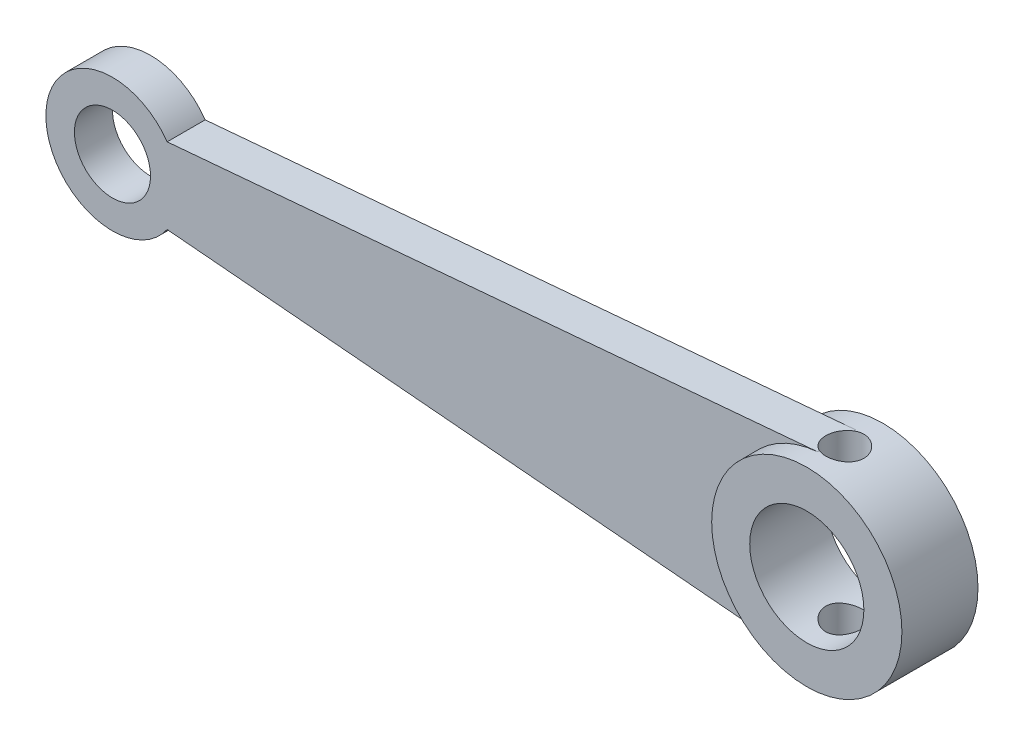
ISO-10303-21;
HEADER;
FILE_DESCRIPTION(('STEP AP214'),'2;1');
FILE_NAME('part.step','',(''),(''),'','','');
FILE_SCHEMA(('AUTOMOTIVE_DESIGN { 1 0 10303 214 1 1 1 1 }'));
ENDSEC;
DATA;
#1=APPLICATION_CONTEXT('core data for automotive mechanical design processes');
#2=APPLICATION_PROTOCOL_DEFINITION('international standard','automotive_design',2000,#1);
#3=PRODUCT_CONTEXT('',#1,'mechanical');
#4=PRODUCT('Part','Part','',(#3));
#5=PRODUCT_RELATED_PRODUCT_CATEGORY('part','',(#4));
#6=PRODUCT_DEFINITION_FORMATION('','',#4);
#7=PRODUCT_DEFINITION_CONTEXT('part definition',#1,'design');
#8=PRODUCT_DEFINITION('design','',#6,#7);
#9=PRODUCT_DEFINITION_SHAPE('','',#8);
#10=(LENGTH_UNIT() NAMED_UNIT(*) SI_UNIT(.MILLI.,.METRE.));
#11=(NAMED_UNIT(*) PLANE_ANGLE_UNIT() SI_UNIT($,.RADIAN.));
#12=(NAMED_UNIT(*) SI_UNIT($,.STERADIAN.) SOLID_ANGLE_UNIT());
#13=UNCERTAINTY_MEASURE_WITH_UNIT(LENGTH_MEASURE(1.E-05),#10,'distance_accuracy_value','');
#14=(GEOMETRIC_REPRESENTATION_CONTEXT(3) GLOBAL_UNCERTAINTY_ASSIGNED_CONTEXT((#13)) GLOBAL_UNIT_ASSIGNED_CONTEXT((#10,
#11,#12)) REPRESENTATION_CONTEXT('',''));
#15=CARTESIAN_POINT('',(0.,0.,0.));
#16=DIRECTION('',(0.,0.,1.));
#17=DIRECTION('',(1.,0.,0.));
#18=AXIS2_PLACEMENT_3D('',#15,#16,#17);
#19=CARTESIAN_POINT('',(0.,-25.,0.));
#20=DIRECTION('',(0.,1.,0.));
#21=DIRECTION('',(0.,0.,1.));
#22=AXIS2_PLACEMENT_3D('',#19,#20,#21);
#23=CYLINDRICAL_SURFACE('',#22,1.);
#24=CARTESIAN_POINT('',(0.,-3.,1.));
#25=CARTESIAN_POINT('',(0.0545633628867233,-3.00000015300943,1.00000025373164));
#26=CARTESIAN_POINT('',(0.10912519453855,-2.99849769507545,0.995519733872783));
#27=CARTESIAN_POINT('',(0.216641760872972,-2.99265210203281,0.977770891182781));
#28=CARTESIAN_POINT('',(0.269596328118818,-2.98830867202153,0.964501656051078));
#29=CARTESIAN_POINT('',(0.372332789501776,-2.97725307906443,0.929680756615952));
#30=CARTESIAN_POINT('',(0.422119825886034,-2.97054487730853,0.908142937540728));
#31=CARTESIAN_POINT('',(0.517374936805325,-2.95544445717342,0.857458827161653));
#32=CARTESIAN_POINT('',(0.562842156958706,-2.94705190667778,0.828311034997399));
#33=CARTESIAN_POINT('',(0.649741675022266,-2.92914094443005,0.762174195141247));
#34=CARTESIAN_POINT('',(0.691003700298309,-2.91959556463785,0.724968765739507));
#35=CARTESIAN_POINT('',(0.766832692702084,-2.90060314783122,0.644232845293434));
#36=CARTESIAN_POINT('',(0.801398185489462,-2.89115613290549,0.600700965071487));
#37=CARTESIAN_POINT('',(0.863824942227859,-2.87313332477274,0.50701488480354));
#38=CARTESIAN_POINT('',(0.891464858221032,-2.86459039275688,0.456706260267877));
#39=CARTESIAN_POINT('',(0.937818873877722,-2.84975305418601,0.351823905541453));
#40=CARTESIAN_POINT('',(0.956535697386765,-2.84345796160746,0.297251482837256));
#41=CARTESIAN_POINT('',(0.983873461509163,-2.83411303269377,0.18732677850329));
#42=CARTESIAN_POINT('',(0.992813448271769,-2.83096095769611,0.132062791510935));
#43=CARTESIAN_POINT('',(1.00134112333448,-2.82795656629508,0.020736245844119));
#44=CARTESIAN_POINT('',(1.00093170160472,-2.8281032302273,-0.0353260607091905));
#45=CARTESIAN_POINT('',(0.991019903703419,-2.8315901500818,-0.143936630444021));
#46=CARTESIAN_POINT('',(0.981933913166995,-2.83478415867533,-0.196528402919019));
#47=CARTESIAN_POINT('',(0.955606162849417,-2.84376657724551,-0.299393419606834));
#48=CARTESIAN_POINT('',(0.938363426591871,-2.84955529784108,-0.34966638543507));
#49=CARTESIAN_POINT('',(0.895939058060211,-2.86317911131249,-0.447412749591479));
#50=CARTESIAN_POINT('',(0.870634048707263,-2.87104565793117,-0.494828025469526));
#51=CARTESIAN_POINT('',(0.812889106303139,-2.88792558575726,-0.584870908279727));
#52=CARTESIAN_POINT('',(0.780447112364005,-2.89693929790464,-0.627497126933381));
#53=CARTESIAN_POINT('',(0.707349332682237,-2.91567329167741,-0.709091598160772));
#54=CARTESIAN_POINT('',(0.666353150076311,-2.92540589354843,-0.74775269450907));
#55=CARTESIAN_POINT('',(0.578339569970064,-2.94406938387037,-0.817731266663398));
#56=CARTESIAN_POINT('',(0.531321595660814,-2.95300019538067,-0.849048038164496));
#57=CARTESIAN_POINT('',(0.431947613046267,-2.96917107937794,-0.903696300235069));
#58=CARTESIAN_POINT('',(0.379543276416336,-2.97639350008039,-0.926945491340732));
#59=CARTESIAN_POINT('',(0.271269083364508,-2.98820567144435,-0.964203173955711));
#60=CARTESIAN_POINT('',(0.215400438154954,-2.99279633654879,-0.978214875423438));
#61=CARTESIAN_POINT('',(0.104383829529304,-2.99867627071441,-0.996055666022358));
#62=CARTESIAN_POINT('',(0.0493095998648451,-3.00010001833731,-1.00029980917275));
#63=CARTESIAN_POINT('',(-0.0607750699602366,-2.99988902694825,-0.999667326401533));
#64=CARTESIAN_POINT('',(-0.115785519319647,-2.99825480419352,-0.994792240020132));
#65=CARTESIAN_POINT('',(-0.222519866304259,-2.99220024717114,-0.976388092264033));
#66=CARTESIAN_POINT('',(-0.274292806834856,-2.98786198711228,-0.963113793950476));
#67=CARTESIAN_POINT('',(-0.374855958579561,-2.97691846830034,-0.928606555533301));
#68=CARTESIAN_POINT('',(-0.423645788508559,-2.97031292046541,-0.907372600532325));
#69=CARTESIAN_POINT('',(-0.518288296393322,-2.95528931287427,-0.8569295681591));
#70=CARTESIAN_POINT('',(-0.56402995921733,-2.94682814756305,-0.8275254067164));
#71=CARTESIAN_POINT('',(-0.650064830135404,-2.92905253915743,-0.761805849986946));
#72=CARTESIAN_POINT('',(-0.690356367794894,-2.91973783591888,-0.725488343969838));
#73=CARTESIAN_POINT('',(-0.766252507807014,-2.90076847982472,-0.645021248991735));
#74=CARTESIAN_POINT('',(-0.801560969248492,-2.89111761095155,-0.600590773066751));
#75=CARTESIAN_POINT('',(-0.864257522320854,-2.87299973286981,-0.5062284321955));
#76=CARTESIAN_POINT('',(-0.891645547920843,-2.8645327335312,-0.456296521389797));
#77=CARTESIAN_POINT('',(-0.93759693042336,-2.84982391820308,-0.352326984693406));
#78=CARTESIAN_POINT('',(-0.956178132197766,-2.84357760900632,-0.298297920757221));
#79=CARTESIAN_POINT('',(-0.983894666792162,-2.83410832399133,-0.187621349875851));
#80=CARTESIAN_POINT('',(-0.993034254961243,-2.83088398622698,-0.130975034566937));
#81=CARTESIAN_POINT('',(-1.00127628247038,-2.82797858875071,-0.019802903986789));
#82=CARTESIAN_POINT('',(-1.00087025731093,-2.82812400344299,0.0346823402517368));
#83=CARTESIAN_POINT('',(-0.991242293454878,-2.8315126992356,0.142765074899743));
#84=CARTESIAN_POINT('',(-0.982020879458887,-2.83475579595884,0.196362617952911));
#85=CARTESIAN_POINT('',(-0.95537181312698,-2.84384524278943,0.300135663012667));
#86=CARTESIAN_POINT('',(-0.938103346014879,-2.84964098015514,0.350356825007233));
#87=CARTESIAN_POINT('',(-0.895979365760381,-2.86316398825434,0.447227406935533));
#88=CARTESIAN_POINT('',(-0.871122168553979,-2.87089168765297,0.493876031187259));
#89=CARTESIAN_POINT('',(-0.813260692583249,-2.8878282922406,0.584483669923692));
#90=CARTESIAN_POINT('',(-0.779948242764532,-2.89708711641604,0.628236501898595));
#91=CARTESIAN_POINT('',(-0.706642883135697,-2.91583356283786,0.709689813383991));
#92=CARTESIAN_POINT('',(-0.666648084451495,-2.92532124912518,0.747388575688018));
#93=CARTESIAN_POINT('',(-0.579241556920674,-2.94390030525393,0.817144412289238));
#94=CARTESIAN_POINT('',(-0.531601513499725,-2.95296181801216,0.848924347751015));
#95=CARTESIAN_POINT('',(-0.431357357406629,-2.96925991172652,0.903990428850631));
#96=CARTESIAN_POINT('',(-0.37875451813235,-2.9764969590794,0.927278745922038));
#97=CARTESIAN_POINT('',(-0.272493647200975,-2.98805515068532,0.963721632488676));
#98=CARTESIAN_POINT('',(-0.218987757676409,-2.9924921242252,0.977282466263377));
#99=CARTESIAN_POINT('',(-0.110320416010247,-2.99846407064225,0.995420280677125));
#100=CARTESIAN_POINT('',(-0.0551594255687465,-2.99999984531906,0.999999743496537));
#101=CARTESIAN_POINT('',(0.,-3.,1.));
#102=B_SPLINE_CURVE_WITH_KNOTS('',3,(#24,#25,#26,#27,#28,#29,#30,#31,#32,#33,#34,#35,#36,#37,
#38,#39,#40,#41,#42,#43,#44,#45,#46,#47,#48,#49,#50,#51,#52,#53,#54,#55,#56,#57,#58,#59,#60,#61,
#62,#63,#64,#65,#66,#67,#68,#69,#70,#71,#72,#73,#74,#75,#76,#77,#78,#79,#80,#81,#82,#83,#84,#85,
#86,#87,#88,#89,#90,#91,#92,#93,#94,#95,#96,#97,#98,#99,#100,#101),.UNSPECIFIED.,.T.,.F.,(4,2,2,
2,2,2,2,2,2,2,2,2,2,2,2,2,2,2,2,2,2,2,2,2,2,2,2,2,2,2,2,2,2,2,2,2,2,2,4),(0.,0.163487106026011,
0.326991185267521,0.490222672870274,0.6534863777991,0.82184684282756,0.990244332875303,
1.1634838482347,1.33667044692833,1.5040192574184,1.67131633987485,1.8309682655128,
1.99063930855482,2.15288171155131,2.31517102558207,2.48593305811367,2.65671145966618,
2.82918405650358,3.00159668877208,3.1665358317517,3.33144713164177,3.49158157978213,
3.65173645284104,3.81610399843736,3.98052180821891,4.15241022880752,4.32430008234997,
4.49584013824416,4.66730284700846,4.82995666056619,4.99260079341185,5.15215587070228,
5.31174638165788,5.47830066681615,5.64490211113589,5.8179966082491,5.99104681142266,
6.15636558363624,6.3216386602795),.UNSPECIFIED.);
#103=CARTESIAN_POINT('',(0.,-3.,1.));
#104=VERTEX_POINT('',#103);
#105=EDGE_CURVE('E40',#104,#104,#102,.T.);
#106=ORIENTED_EDGE('',*,*,#105,.T.);
#107=EDGE_LOOP('',(#106));
#108=FACE_BOUND('',#107,.T.);
#109=CARTESIAN_POINT('',(0.,-5.01902540655219,0.));
#110=DIRECTION('',(0.0869881946922538,0.99620934244976,0.));
#111=DIRECTION('',(-0.99620934244976,0.0869881946922538,0.));
#112=AXIS2_PLACEMENT_3D('',#109,#110,#111);
#113=ELLIPSE('',#112,1.00380508131044,1.);
#114=CARTESIAN_POINT('',(-0.434940973461269,-4.9810467122488,-0.900458966085942));
#115=VERTEX_POINT('',#114);
#116=CARTESIAN_POINT('',(-0.434940973461269,-4.9810467122488,0.900458966085942));
#117=VERTEX_POINT('',#116);
#118=EDGE_CURVE('E11',#115,#117,#113,.T.);
#119=ORIENTED_EDGE('',*,*,#118,.F.);
#120=CARTESIAN_POINT('',(0.,-5.,1.));
#121=CARTESIAN_POINT('',(0.0555769067926332,-4.99999897580871,0.999997955501655));
#122=CARTESIAN_POINT('',(0.111179660201522,-4.99906385178231,0.995351157032355));
#123=CARTESIAN_POINT('',(0.220813507689019,-4.99542365623231,0.976901499884755));
#124=CARTESIAN_POINT('',(0.274843317541356,-4.99271717860186,0.96309136719849));
#125=CARTESIAN_POINT('',(0.379730305263313,-4.98583649278287,0.926758726379211));
#126=CARTESIAN_POINT('',(0.430590467933134,-4.98166369076718,0.904244563155312));
#127=CARTESIAN_POINT('',(0.527807988864225,-4.97230398035314,0.851167752488706));
#128=CARTESIAN_POINT('',(0.574165615075812,-4.96711713235707,0.820605584392795));
#129=CARTESIAN_POINT('',(0.661693477314865,-4.9562216532997,0.751861505708566));
#130=CARTESIAN_POINT('',(0.702793951158524,-4.95050745504347,0.713591644608798));
#131=CARTESIAN_POINT('',(0.778036756608028,-4.93924180452588,0.630707583608298));
#132=CARTESIAN_POINT('',(0.812178544770424,-4.93369036500424,0.586092888664882));
#133=CARTESIAN_POINT('',(0.87283175334762,-4.92332441812615,0.491283806988125));
#134=CARTESIAN_POINT('',(0.899270938865866,-4.91851707364946,0.441042356203641));
#135=CARTESIAN_POINT('',(0.943305666580308,-4.91026268058418,0.336718180995921));
#136=CARTESIAN_POINT('',(0.960902082437238,-4.90681549761962,0.282635836653655));
#137=CARTESIAN_POINT('',(0.986525299884827,-4.90172805252204,0.172915636092083));
#138=CARTESIAN_POINT('',(0.994674497958777,-4.90006470107188,0.117307455857774));
#139=CARTESIAN_POINT('',(1.00155212772612,-4.89866375060627,0.0054901786356578));
#140=CARTESIAN_POINT('',(1.0002815227135,-4.89892595467841,-0.050718856320145));
#141=CARTESIAN_POINT('',(0.988454573101819,-4.90132551148185,-0.161246788021003));
#142=CARTESIAN_POINT('',(0.978038540243905,-4.90343452858763,-0.215581405627314));
#143=CARTESIAN_POINT('',(0.94843788462305,-4.90924546160001,-0.321716076663002));
#144=CARTESIAN_POINT('',(0.929252843100681,-4.91294745357779,-0.373516008919008));
#145=CARTESIAN_POINT('',(0.88252478367472,-4.92155618500408,-0.473515261703599));
#146=CARTESIAN_POINT('',(0.854926151232114,-4.92647089813704,-0.521687879569172));
#147=CARTESIAN_POINT('',(0.792193574572679,-4.93694618773062,-0.612770849972814));
#148=CARTESIAN_POINT('',(0.757058764356829,-4.94250683838366,-0.655680596851157));
#149=CARTESIAN_POINT('',(0.679499934560584,-4.95377021241462,-0.735829402456936));
#150=CARTESIAN_POINT('',(0.636956161212445,-4.95947369210905,-0.77295256785913));
#151=CARTESIAN_POINT('',(0.54618502406201,-4.97028848714408,-0.839553846301224));
#152=CARTESIAN_POINT('',(0.497957587379389,-4.97539979488974,-0.869031861293579));
#153=CARTESIAN_POINT('',(0.397059386878921,-4.98446690160887,-0.919527509225975));
#154=CARTESIAN_POINT('',(0.3443818195853,-4.98842088848272,-0.940531893644537));
#155=CARTESIAN_POINT('',(0.236148976448665,-4.99471408987858,-0.973360474038566));
#156=CARTESIAN_POINT('',(0.18059405007245,-4.99705350000531,-0.985185782073628));
#157=CARTESIAN_POINT('',(0.0691794056271506,-4.99982671866868,-0.999156453794277));
#158=CARTESIAN_POINT('',(0.0133403283255763,-5.0002917465247,-1.00146041954027));
#159=CARTESIAN_POINT('',(-0.097924934192714,-4.99935051930103,-0.996750141057819));
#160=CARTESIAN_POINT('',(-0.153351142443793,-4.99794436941446,-0.989736420647404));
#161=CARTESIAN_POINT('',(-0.261705659946541,-4.99343832008018,-0.966721626456044));
#162=CARTESIAN_POINT('',(-0.314651948339903,-4.99035376404206,-0.950801931502097));
#163=CARTESIAN_POINT('',(-0.417123627499667,-4.98283552061033,-0.910516017344191));
#164=CARTESIAN_POINT('',(-0.466648761637539,-4.97840173214227,-0.88614916532317));
#165=CARTESIAN_POINT('',(-0.561541173686217,-4.96859911533294,-0.829317509348687));
#166=CARTESIAN_POINT('',(-0.606850126752188,-4.96321950437052,-0.796757218961055));
#167=CARTESIAN_POINT('',(-0.691418019119206,-4.95214734829882,-0.724590808792719));
#168=CARTESIAN_POINT('',(-0.730676308930762,-4.94645476968388,-0.684983933600133));
#169=CARTESIAN_POINT('',(-0.802640590774176,-4.93529303556965,-0.599126648108876));
#170=CARTESIAN_POINT('',(-0.835237702448655,-4.92982860233304,-0.552784255778663));
#171=CARTESIAN_POINT('',(-0.892185420051206,-4.91984191796194,-0.455188638643321));
#172=CARTESIAN_POINT('',(-0.916536355922903,-4.91531962913342,-0.403935610426447));
#173=CARTESIAN_POINT('',(-0.95615184158196,-4.90776740584383,-0.298231753850452));
#174=CARTESIAN_POINT('',(-0.971463499791051,-4.90472974872187,-0.243799158789681));
#175=CARTESIAN_POINT('',(-0.992708651627196,-4.90047436792025,-0.133066546509095));
#176=CARTESIAN_POINT('',(-0.998643368225112,-4.89925640691111,-0.0767667737906527));
#177=CARTESIAN_POINT('',(-1.00092091086747,-4.89879149631379,0.0350088645443185));
#178=CARTESIAN_POINT('',(-0.997435788070896,-4.89950919189301,0.0904811489270093));
#179=CARTESIAN_POINT('',(-0.981352304100061,-4.90275573484614,0.200031649905026));
#180=CARTESIAN_POINT('',(-0.968754016129298,-4.90528456767169,0.254109877694805));
#181=CARTESIAN_POINT('',(-0.934878568498954,-4.91185264219159,0.359227711240545));
#182=CARTESIAN_POINT('',(-0.913622506717345,-4.91588821018831,0.410274360502415));
#183=CARTESIAN_POINT('',(-0.863054644601604,-4.9250171497417,0.508103720734441));
#184=CARTESIAN_POINT('',(-0.833742168774882,-4.93011060998894,0.554886073725137));
#185=CARTESIAN_POINT('',(-0.767305914786414,-4.94088960523225,0.643715572150314));
#186=CARTESIAN_POINT('',(-0.73005788723518,-4.94658372909699,0.685668765267596));
#187=CARTESIAN_POINT('',(-0.649064369013141,-4.95786081871955,0.762786205529171));
#188=CARTESIAN_POINT('',(-0.605317387153335,-4.96344375863184,0.797948890317272));
#189=CARTESIAN_POINT('',(-0.512017629088246,-4.97393832387971,0.860834643946447));
#190=CARTESIAN_POINT('',(-0.462408884429835,-4.97884231219246,0.888476003280025));
#191=CARTESIAN_POINT('',(-0.359166360940733,-4.98735125085,0.934986122596592));
#192=CARTESIAN_POINT('',(-0.305536260863126,-4.99095737138616,0.953862789532492));
#193=CARTESIAN_POINT('',(-0.209821488923779,-4.99576372595371,0.978651948044716));
#194=CARTESIAN_POINT('',(-0.168281664013785,-4.99734303158452,0.986643193707758));
#195=CARTESIAN_POINT('',(-0.084499525210067,-4.99946154139893,0.997317912358364));
#196=CARTESIAN_POINT('',(-0.042257233748619,-5.00000077873155,1.00000155450977));
#197=CARTESIAN_POINT('',(0.,-5.,1.));
#198=B_SPLINE_CURVE_WITH_KNOTS('',3,(#120,#121,#122,#123,#124,#125,#126,#127,#128,#129,#130,
#131,#132,#133,#134,#135,#136,#137,#138,#139,#140,#141,#142,#143,#144,#145,#146,#147,#148,#149,
#150,#151,#152,#153,#154,#155,#156,#157,#158,#159,#160,#161,#162,#163,#164,#165,#166,#167,#168,
#169,#170,#171,#172,#173,#174,#175,#176,#177,#178,#179,#180,#181,#182,#183,#184,#185,#186,#187,
#188,#189,#190,#191,#192,#193,#194,#195,#196,#197),.UNSPECIFIED.,.T.,.F.,(4,2,2,2,2,2,2,2,2,2,2,
2,2,2,2,2,2,2,2,2,2,2,2,2,2,2,2,2,2,2,2,2,2,2,2,2,2,2,4),(0.,0.166576130661258,
0.333284650691323,0.499833735250341,0.666372902230863,0.834932670112186,1.00350559674737,
1.17361195005923,1.34370149365197,1.51156185103587,1.67940504281225,1.84471727006278,
2.0100373925373,2.17647490203593,2.3429315474967,2.51238252491351,2.6818356753982,
2.85155274854024,3.02124925698036,3.18810735676265,3.35495607657868,3.52030453950723,
3.68566539216022,3.85305066033358,4.0204538834593,4.19040628579226,4.36035188723466,
4.52940381032723,4.69843368330415,4.86439722567701,5.03035943492608,5.1959196125311,
5.36149367581867,5.52988076239143,5.6983065453293,5.86849496675637,6.03852955517519,
6.16518775289894,6.29184191370996),.UNSPECIFIED.);
#199=EDGE_CURVE('E64',#117,#115,#198,.T.);
#200=ORIENTED_EDGE('',*,*,#199,.F.);
#201=EDGE_LOOP('',(#119,#200));
#202=FACE_BOUND('',#201,.T.);
#203=ADVANCED_FACE('F35',(#108,#202),#23,.F.);
#204=CARTESIAN_POINT('',(0.,0.,-1.));
#205=DIRECTION('',(0.,0.,1.));
#206=DIRECTION('',(1.,0.,0.));
#207=AXIS2_PLACEMENT_3D('',#204,#205,#206);
#208=PLANE('',#207);
#209=CARTESIAN_POINT('',(-37.5,0.,-1.));
#210=DIRECTION('',(0.,0.,1.));
#211=DIRECTION('',(1.,0.,0.));
#212=AXIS2_PLACEMENT_3D('',#209,#210,#211);
#213=CIRCLE('',#212,2.);
#214=CARTESIAN_POINT('',(-35.5,0.,-1.));
#215=VERTEX_POINT('',#214);
#216=EDGE_CURVE('E119',#215,#215,#213,.T.);
#217=ORIENTED_EDGE('',*,*,#216,.T.);
#218=EDGE_LOOP('',(#217));
#219=FACE_BOUND('',#218,.T.);
#220=CARTESIAN_POINT('',(0.,0.,-1.));
#221=DIRECTION('',(0.,0.,1.));
#222=DIRECTION('',(1.,0.,0.));
#223=AXIS2_PLACEMENT_3D('',#220,#221,#222);
#224=CIRCLE('',#223,5.);
#225=CARTESIAN_POINT('',(-0.434940973461269,-4.9810467122488,-1.));
#226=VERTEX_POINT('',#225);
#227=CARTESIAN_POINT('',(-0.434940973461269,4.9810467122488,-1.));
#228=VERTEX_POINT('',#227);
#229=EDGE_CURVE('E50',#226,#228,#224,.F.);
#230=ORIENTED_EDGE('',*,*,#229,.F.);
#231=DIRECTION('',(0.99620934244976,-0.0869881946922538,0.));
#232=VECTOR('',#231,1.);
#233=CARTESIAN_POINT('',(-0.434940973461269,-4.9810467122488,-1.));
#234=LINE('',#233,#232);
#235=CARTESIAN_POINT('',(-34.6246782875445,-1.9956264805524,-1.));
#236=VERTEX_POINT('',#235);
#237=EDGE_CURVE('E110',#236,#226,#234,.T.);
#238=ORIENTED_EDGE('',*,*,#237,.F.);
#239=CARTESIAN_POINT('',(-37.5,0.,-1.));
#240=DIRECTION('',(0.,0.,1.));
#241=DIRECTION('',(1.,0.,0.));
#242=AXIS2_PLACEMENT_3D('',#239,#240,#241);
#243=CIRCLE('',#242,3.5);
#244=CARTESIAN_POINT('',(-34.6246782875445,1.9956264805524,-1.));
#245=VERTEX_POINT('',#244);
#246=EDGE_CURVE('E190',#245,#236,#243,.T.);
#247=ORIENTED_EDGE('',*,*,#246,.F.);
#248=DIRECTION('',(0.99620934244976,0.0869881946922537,0.));
#249=VECTOR('',#248,1.);
#250=CARTESIAN_POINT('',(-0.434940973461269,4.9810467122488,-1.));
#251=LINE('',#250,#249);
#252=EDGE_CURVE('E182',#245,#228,#251,.T.);
#253=ORIENTED_EDGE('',*,*,#252,.T.);
#254=EDGE_LOOP('',(#230,#238,#247,#253));
#255=FACE_BOUND('',#254,.T.);
#256=ADVANCED_FACE('F153',(#219,#255),#208,.F.);
#257=CARTESIAN_POINT('',(0.,0.,1.));
#258=DIRECTION('',(0.,0.,1.));
#259=DIRECTION('',(1.,0.,0.));
#260=AXIS2_PLACEMENT_3D('',#257,#258,#259);
#261=PLANE('',#260);
#262=CARTESIAN_POINT('',(-37.5,0.,1.));
#263=DIRECTION('',(0.,0.,1.));
#264=DIRECTION('',(1.,0.,0.));
#265=AXIS2_PLACEMENT_3D('',#262,#263,#264);
#266=CIRCLE('',#265,2.);
#267=CARTESIAN_POINT('',(-35.5,0.,1.));
#268=VERTEX_POINT('',#267);
#269=EDGE_CURVE('E111',#268,#268,#266,.T.);
#270=ORIENTED_EDGE('',*,*,#269,.F.);
#271=EDGE_LOOP('',(#270));
#272=FACE_BOUND('',#271,.T.);
#273=DIRECTION('',(0.99620934244976,-0.0869881946922538,0.));
#274=VECTOR('',#273,1.);
#275=CARTESIAN_POINT('',(-0.434940973461269,-4.9810467122488,1.));
#276=LINE('',#275,#274);
#277=CARTESIAN_POINT('',(-34.6246782875445,-1.9956264805524,1.));
#278=VERTEX_POINT('',#277);
#279=CARTESIAN_POINT('',(-0.434940973461269,-4.9810467122488,1.));
#280=VERTEX_POINT('',#279);
#281=EDGE_CURVE('E115',#278,#280,#276,.T.);
#282=ORIENTED_EDGE('',*,*,#281,.T.);
#283=CARTESIAN_POINT('',(0.,0.,1.));
#284=DIRECTION('',(0.,0.,1.));
#285=DIRECTION('',(1.,0.,0.));
#286=AXIS2_PLACEMENT_3D('',#283,#284,#285);
#287=CIRCLE('',#286,5.);
#288=CARTESIAN_POINT('',(-0.434940973461269,4.9810467122488,1.));
#289=VERTEX_POINT('',#288);
#290=EDGE_CURVE('E128',#280,#289,#287,.F.);
#291=ORIENTED_EDGE('',*,*,#290,.T.);
#292=DIRECTION('',(0.99620934244976,0.0869881946922537,0.));
#293=VECTOR('',#292,1.);
#294=CARTESIAN_POINT('',(-0.434940973461269,4.9810467122488,1.));
#295=LINE('',#294,#293);
#296=CARTESIAN_POINT('',(-34.6246782875445,1.9956264805524,1.));
#297=VERTEX_POINT('',#296);
#298=EDGE_CURVE('E183',#297,#289,#295,.T.);
#299=ORIENTED_EDGE('',*,*,#298,.F.);
#300=CARTESIAN_POINT('',(-37.5,0.,1.));
#301=DIRECTION('',(0.,0.,1.));
#302=DIRECTION('',(1.,0.,0.));
#303=AXIS2_PLACEMENT_3D('',#300,#301,#302);
#304=CIRCLE('',#303,3.5);
#305=EDGE_CURVE('E185',#297,#278,#304,.T.);
#306=ORIENTED_EDGE('',*,*,#305,.T.);
#307=EDGE_LOOP('',(#282,#291,#299,#306));
#308=FACE_BOUND('',#307,.T.);
#309=ADVANCED_FACE('F158',(#272,#308),#261,.T.);
#310=CARTESIAN_POINT('',(0.,0.,1.));
#311=DIRECTION('',(0.,0.,-1.));
#312=DIRECTION('',(-1.,0.,0.));
#313=AXIS2_PLACEMENT_3D('',#310,#311,#312);
#314=CYLINDRICAL_SURFACE('',#313,5.);
#315=DIRECTION('',(0.,0.,-1.));
#316=VECTOR('',#315,1.);
#317=CARTESIAN_POINT('',(-0.434940973461269,-4.9810467122488,1.));
#318=LINE('',#317,#316);
#319=EDGE_CURVE('E102',#280,#117,#318,.T.);
#320=ORIENTED_EDGE('',*,*,#319,.T.);
#321=ORIENTED_EDGE('',*,*,#199,.T.);
#322=EDGE_CURVE('E99',#115,#226,#318,.T.);
#323=ORIENTED_EDGE('',*,*,#322,.T.);
#324=ORIENTED_EDGE('',*,*,#229,.T.);
#325=DIRECTION('',(0.,0.,-1.));
#326=VECTOR('',#325,1.);
#327=CARTESIAN_POINT('',(-0.434940973461269,4.9810467122488,1.));
#328=LINE('',#327,#326);
#329=CARTESIAN_POINT('',(-0.434940973461269,4.9810467122488,-0.900458966085942));
#330=VERTEX_POINT('',#329);
#331=EDGE_CURVE('E124',#330,#228,#328,.T.);
#332=ORIENTED_EDGE('',*,*,#331,.F.);
#333=CARTESIAN_POINT('',(0.,5.,1.));
#334=CARTESIAN_POINT('',(-0.0555769067926332,4.99999897580871,0.999997955501655));
#335=CARTESIAN_POINT('',(-0.111179660201522,4.99906385178231,0.995351157032355));
#336=CARTESIAN_POINT('',(-0.220813507689019,4.99542365623231,0.976901499884755));
#337=CARTESIAN_POINT('',(-0.274843317541356,4.99271717860186,0.96309136719849));
#338=CARTESIAN_POINT('',(-0.379730305263313,4.98583649278287,0.926758726379211));
#339=CARTESIAN_POINT('',(-0.430590467933134,4.98166369076718,0.904244563155312));
#340=CARTESIAN_POINT('',(-0.527807988864225,4.97230398035314,0.851167752488706));
#341=CARTESIAN_POINT('',(-0.574165615075812,4.96711713235707,0.820605584392795));
#342=CARTESIAN_POINT('',(-0.661693477314865,4.9562216532997,0.751861505708566));
#343=CARTESIAN_POINT('',(-0.702793951158524,4.95050745504347,0.713591644608798));
#344=CARTESIAN_POINT('',(-0.778036756608028,4.93924180452588,0.630707583608298));
#345=CARTESIAN_POINT('',(-0.812178544770424,4.93369036500424,0.586092888664882));
#346=CARTESIAN_POINT('',(-0.87283175334762,4.92332441812615,0.491283806988125));
#347=CARTESIAN_POINT('',(-0.899270938865866,4.91851707364946,0.441042356203641));
#348=CARTESIAN_POINT('',(-0.943305666580308,4.91026268058418,0.336718180995921));
#349=CARTESIAN_POINT('',(-0.960902082437238,4.90681549761962,0.282635836653655));
#350=CARTESIAN_POINT('',(-0.986525299884827,4.90172805252204,0.172915636092083));
#351=CARTESIAN_POINT('',(-0.994674497958777,4.90006470107188,0.117307455857774));
#352=CARTESIAN_POINT('',(-1.00155212772612,4.89866375060627,0.0054901786356578));
#353=CARTESIAN_POINT('',(-1.0002815227135,4.89892595467841,-0.050718856320145));
#354=CARTESIAN_POINT('',(-0.988454573101819,4.90132551148185,-0.161246788021003));
#355=CARTESIAN_POINT('',(-0.978038540243905,4.90343452858763,-0.215581405627314));
#356=CARTESIAN_POINT('',(-0.94843788462305,4.90924546160001,-0.321716076663002));
#357=CARTESIAN_POINT('',(-0.929252843100681,4.91294745357779,-0.373516008919008));
#358=CARTESIAN_POINT('',(-0.88252478367472,4.92155618500408,-0.473515261703599));
#359=CARTESIAN_POINT('',(-0.854926151232114,4.92647089813704,-0.521687879569172));
#360=CARTESIAN_POINT('',(-0.792193574572679,4.93694618773062,-0.612770849972814));
#361=CARTESIAN_POINT('',(-0.757058764356829,4.94250683838366,-0.655680596851157));
#362=CARTESIAN_POINT('',(-0.679499934560584,4.95377021241462,-0.735829402456936));
#363=CARTESIAN_POINT('',(-0.636956161212445,4.95947369210905,-0.77295256785913));
#364=CARTESIAN_POINT('',(-0.54618502406201,4.97028848714408,-0.839553846301224));
#365=CARTESIAN_POINT('',(-0.497957587379389,4.97539979488974,-0.869031861293579));
#366=CARTESIAN_POINT('',(-0.397059386878921,4.98446690160887,-0.919527509225975));
#367=CARTESIAN_POINT('',(-0.3443818195853,4.98842088848272,-0.940531893644537));
#368=CARTESIAN_POINT('',(-0.236148976448665,4.99471408987858,-0.973360474038566));
#369=CARTESIAN_POINT('',(-0.18059405007245,4.99705350000531,-0.985185782073628));
#370=CARTESIAN_POINT('',(-0.0691794056271506,4.99982671866868,-0.999156453794277));
#371=CARTESIAN_POINT('',(-0.0133403283255763,5.0002917465247,-1.00146041954027));
#372=CARTESIAN_POINT('',(0.097924934192714,4.99935051930103,-0.996750141057819));
#373=CARTESIAN_POINT('',(0.153351142443793,4.99794436941446,-0.989736420647404));
#374=CARTESIAN_POINT('',(0.261705659946541,4.99343832008018,-0.966721626456044));
#375=CARTESIAN_POINT('',(0.314651948339903,4.99035376404206,-0.950801931502097));
#376=CARTESIAN_POINT('',(0.417123627499667,4.98283552061033,-0.910516017344191));
#377=CARTESIAN_POINT('',(0.466648761637539,4.97840173214227,-0.88614916532317));
#378=CARTESIAN_POINT('',(0.561541173686217,4.96859911533294,-0.829317509348687));
#379=CARTESIAN_POINT('',(0.606850126752188,4.96321950437052,-0.796757218961055));
#380=CARTESIAN_POINT('',(0.691418019119206,4.95214734829882,-0.724590808792719));
#381=CARTESIAN_POINT('',(0.730676308930762,4.94645476968388,-0.684983933600133));
#382=CARTESIAN_POINT('',(0.802640590774176,4.93529303556965,-0.599126648108876));
#383=CARTESIAN_POINT('',(0.835237702448655,4.92982860233304,-0.552784255778663));
#384=CARTESIAN_POINT('',(0.892185420051206,4.91984191796194,-0.455188638643321));
#385=CARTESIAN_POINT('',(0.916536355922903,4.91531962913342,-0.403935610426447));
#386=CARTESIAN_POINT('',(0.95615184158196,4.90776740584383,-0.298231753850452));
#387=CARTESIAN_POINT('',(0.971463499791051,4.90472974872187,-0.243799158789681));
#388=CARTESIAN_POINT('',(0.992708651627196,4.90047436792025,-0.133066546509095));
#389=CARTESIAN_POINT('',(0.998643368225112,4.89925640691111,-0.0767667737906527));
#390=CARTESIAN_POINT('',(1.00092091086747,4.89879149631379,0.0350088645443185));
#391=CARTESIAN_POINT('',(0.997435788070896,4.89950919189301,0.0904811489270093));
#392=CARTESIAN_POINT('',(0.981352304100061,4.90275573484614,0.200031649905026));
#393=CARTESIAN_POINT('',(0.968754016129298,4.90528456767169,0.254109877694805));
#394=CARTESIAN_POINT('',(0.934878568498954,4.91185264219159,0.359227711240545));
#395=CARTESIAN_POINT('',(0.913622506717345,4.91588821018831,0.410274360502415));
#396=CARTESIAN_POINT('',(0.863054644601604,4.9250171497417,0.508103720734441));
#397=CARTESIAN_POINT('',(0.833742168774882,4.93011060998894,0.554886073725137));
#398=CARTESIAN_POINT('',(0.767305914786414,4.94088960523225,0.643715572150314));
#399=CARTESIAN_POINT('',(0.73005788723518,4.94658372909699,0.685668765267596));
#400=CARTESIAN_POINT('',(0.649064369013141,4.95786081871955,0.762786205529171));
#401=CARTESIAN_POINT('',(0.605317387153335,4.96344375863184,0.797948890317272));
#402=CARTESIAN_POINT('',(0.512017629088246,4.97393832387971,0.860834643946447));
#403=CARTESIAN_POINT('',(0.462408884429835,4.97884231219246,0.888476003280025));
#404=CARTESIAN_POINT('',(0.359166360940733,4.98735125085,0.934986122596592));
#405=CARTESIAN_POINT('',(0.305536260863126,4.99095737138616,0.953862789532492));
#406=CARTESIAN_POINT('',(0.209821488923779,4.99576372595371,0.978651948044716));
#407=CARTESIAN_POINT('',(0.168281664013785,4.99734303158452,0.986643193707758));
#408=CARTESIAN_POINT('',(0.084499525210067,4.99946154139893,0.997317912358364));
#409=CARTESIAN_POINT('',(0.042257233748619,5.00000077873155,1.00000155450977));
#410=CARTESIAN_POINT('',(0.,5.,1.));
#411=B_SPLINE_CURVE_WITH_KNOTS('',3,(#333,#334,#335,#336,#337,#338,#339,#340,#341,#342,#343,
#344,#345,#346,#347,#348,#349,#350,#351,#352,#353,#354,#355,#356,#357,#358,#359,#360,#361,#362,
#363,#364,#365,#366,#367,#368,#369,#370,#371,#372,#373,#374,#375,#376,#377,#378,#379,#380,#381,
#382,#383,#384,#385,#386,#387,#388,#389,#390,#391,#392,#393,#394,#395,#396,#397,#398,#399,#400,
#401,#402,#403,#404,#405,#406,#407,#408,#409,#410),.UNSPECIFIED.,.T.,.F.,(4,2,2,2,2,2,2,2,2,2,2,
2,2,2,2,2,2,2,2,2,2,2,2,2,2,2,2,2,2,2,2,2,2,2,2,2,2,2,4),(0.,0.166576130661258,
0.333284650691323,0.499833735250341,0.666372902230863,0.834932670112186,1.00350559674737,
1.17361195005923,1.34370149365197,1.51156185103587,1.67940504281225,1.84471727006278,
2.0100373925373,2.17647490203593,2.3429315474967,2.51238252491351,2.6818356753982,
2.85155274854024,3.02124925698036,3.18810735676265,3.35495607657868,3.52030453950723,
3.68566539216022,3.85305066033358,4.0204538834593,4.19040628579226,4.36035188723466,
4.52940381032723,4.69843368330415,4.86439722567701,5.03035943492608,5.1959196125311,
5.36149367581867,5.52988076239143,5.6983065453293,5.86849496675637,6.03852955517519,
6.16518775289894,6.29184191370996),.UNSPECIFIED.);
#412=CARTESIAN_POINT('',(-0.434940973461269,4.9810467122488,0.900458966085942));
#413=VERTEX_POINT('',#412);
#414=EDGE_CURVE('E57',#330,#413,#411,.T.);
#415=ORIENTED_EDGE('',*,*,#414,.T.);
#416=EDGE_CURVE('E125',#289,#413,#328,.T.);
#417=ORIENTED_EDGE('',*,*,#416,.F.);
#418=ORIENTED_EDGE('',*,*,#290,.F.);
#419=EDGE_LOOP('',(#320,#321,#323,#324,#332,#415,#417,#418));
#420=FACE_BOUND('',#419,.T.);
#421=CARTESIAN_POINT('',(0.,0.,-2.));
#422=DIRECTION('',(0.,0.,-1.));
#423=DIRECTION('',(-1.,0.,0.));
#424=AXIS2_PLACEMENT_3D('',#421,#422,#423);
#425=CIRCLE('',#424,5.);
#426=CARTESIAN_POINT('',(-5.,0.,-2.));
#427=VERTEX_POINT('',#426);
#428=EDGE_CURVE('E176',#427,#427,#425,.T.);
#429=ORIENTED_EDGE('',*,*,#428,.F.);
#430=EDGE_LOOP('',(#429));
#431=FACE_BOUND('',#430,.T.);
#432=CARTESIAN_POINT('',(0.,0.,2.));
#433=DIRECTION('',(0.,0.,1.));
#434=DIRECTION('',(1.,0.,0.));
#435=AXIS2_PLACEMENT_3D('',#432,#433,#434);
#436=CIRCLE('',#435,5.);
#437=CARTESIAN_POINT('',(5.,0.,2.));
#438=VERTEX_POINT('',#437);
#439=EDGE_CURVE('E179',#438,#438,#436,.T.);
#440=ORIENTED_EDGE('',*,*,#439,.F.);
#441=EDGE_LOOP('',(#440));
#442=FACE_BOUND('',#441,.T.);
#443=ADVANCED_FACE('F37',(#420,#431,#442),#314,.T.);
#444=CARTESIAN_POINT('',(-0.434940973461269,4.9810467122488,1.));
#445=DIRECTION('',(-0.0869881946922537,0.99620934244976,0.));
#446=DIRECTION('',(-0.99620934244976,-0.0869881946922537,0.));
#447=AXIS2_PLACEMENT_3D('',#444,#445,#446);
#448=PLANE('',#447);
#449=CARTESIAN_POINT('',(0.,5.01902540655219,0.));
#450=DIRECTION('',(-0.0869881946922537,0.99620934244976,0.));
#451=DIRECTION('',(0.99620934244976,0.0869881946922537,0.));
#452=AXIS2_PLACEMENT_3D('',#449,#450,#451);
#453=ELLIPSE('',#452,1.00380508131044,1.);
#454=EDGE_CURVE('E103',#330,#413,#453,.T.);
#455=ORIENTED_EDGE('',*,*,#454,.F.);
#456=ORIENTED_EDGE('',*,*,#331,.T.);
#457=ORIENTED_EDGE('',*,*,#252,.F.);
#458=DIRECTION('',(0.,0.,-1.));
#459=VECTOR('',#458,1.);
#460=CARTESIAN_POINT('',(-34.6246782875445,1.9956264805524,1.));
#461=LINE('',#460,#459);
#462=EDGE_CURVE('E122',#297,#245,#461,.T.);
#463=ORIENTED_EDGE('',*,*,#462,.F.);
#464=ORIENTED_EDGE('',*,*,#298,.T.);
#465=ORIENTED_EDGE('',*,*,#416,.T.);
#466=EDGE_LOOP('',(#455,#456,#457,#463,#464,#465));
#467=FACE_BOUND('',#466,.T.);
#468=ADVANCED_FACE('F211',(#467),#448,.T.);
#469=CARTESIAN_POINT('',(-37.5,0.,1.));
#470=DIRECTION('',(0.,0.,-1.));
#471=DIRECTION('',(-1.,0.,0.));
#472=AXIS2_PLACEMENT_3D('',#469,#470,#471);
#473=CYLINDRICAL_SURFACE('',#472,3.5);
#474=ORIENTED_EDGE('',*,*,#246,.T.);
#475=DIRECTION('',(0.,0.,-1.));
#476=VECTOR('',#475,1.);
#477=CARTESIAN_POINT('',(-34.6246782875445,-1.9956264805524,1.));
#478=LINE('',#477,#476);
#479=EDGE_CURVE('E113',#278,#236,#478,.T.);
#480=ORIENTED_EDGE('',*,*,#479,.F.);
#481=ORIENTED_EDGE('',*,*,#305,.F.);
#482=ORIENTED_EDGE('',*,*,#462,.T.);
#483=EDGE_LOOP('',(#474,#480,#481,#482));
#484=FACE_BOUND('',#483,.T.);
#485=ADVANCED_FACE('F206',(#484),#473,.T.);
#486=CARTESIAN_POINT('',(-0.434940973461269,-4.9810467122488,1.));
#487=DIRECTION('',(0.0869881946922538,0.99620934244976,0.));
#488=DIRECTION('',(-0.99620934244976,0.0869881946922538,0.));
#489=AXIS2_PLACEMENT_3D('',#486,#487,#488);
#490=PLANE('',#489);
#491=ORIENTED_EDGE('',*,*,#322,.F.);
#492=ORIENTED_EDGE('',*,*,#118,.T.);
#493=ORIENTED_EDGE('',*,*,#319,.F.);
#494=ORIENTED_EDGE('',*,*,#281,.F.);
#495=ORIENTED_EDGE('',*,*,#479,.T.);
#496=ORIENTED_EDGE('',*,*,#237,.T.);
#497=EDGE_LOOP('',(#491,#492,#493,#494,#495,#496));
#498=FACE_BOUND('',#497,.T.);
#499=ADVANCED_FACE('F107',(#498),#490,.F.);
#500=CARTESIAN_POINT('',(-37.5,0.,1.));
#501=DIRECTION('',(0.,0.,-1.));
#502=DIRECTION('',(-1.,0.,0.));
#503=AXIS2_PLACEMENT_3D('',#500,#501,#502);
#504=CYLINDRICAL_SURFACE('',#503,2.);
#505=ORIENTED_EDGE('',*,*,#269,.T.);
#506=EDGE_LOOP('',(#505));
#507=FACE_BOUND('',#506,.T.);
#508=ORIENTED_EDGE('',*,*,#216,.F.);
#509=EDGE_LOOP('',(#508));
#510=FACE_BOUND('',#509,.T.);
#511=ADVANCED_FACE('F195',(#507,#510),#504,.F.);
#512=CARTESIAN_POINT('',(0.,0.,2.));
#513=DIRECTION('',(0.,0.,1.));
#514=DIRECTION('',(1.,0.,0.));
#515=AXIS2_PLACEMENT_3D('',#512,#513,#514);
#516=PLANE('',#515);
#517=CARTESIAN_POINT('',(0.,0.,2.));
#518=DIRECTION('',(0.,0.,1.));
#519=DIRECTION('',(1.,0.,0.));
#520=AXIS2_PLACEMENT_3D('',#517,#518,#519);
#521=CIRCLE('',#520,3.);
#522=CARTESIAN_POINT('',(3.,0.,2.));
#523=VERTEX_POINT('',#522);
#524=EDGE_CURVE('E104',#523,#523,#521,.T.);
#525=ORIENTED_EDGE('',*,*,#524,.F.);
#526=EDGE_LOOP('',(#525));
#527=FACE_BOUND('',#526,.T.);
#528=ORIENTED_EDGE('',*,*,#439,.T.);
#529=EDGE_LOOP('',(#528));
#530=FACE_BOUND('',#529,.T.);
#531=ADVANCED_FACE('F197',(#527,#530),#516,.T.);
#532=CARTESIAN_POINT('',(0.,0.,-2.));
#533=DIRECTION('',(0.,0.,-1.));
#534=DIRECTION('',(-1.,0.,0.));
#535=AXIS2_PLACEMENT_3D('',#532,#533,#534);
#536=PLANE('',#535);
#537=CARTESIAN_POINT('',(0.,0.,-2.));
#538=DIRECTION('',(0.,0.,-1.));
#539=DIRECTION('',(-1.,0.,0.));
#540=AXIS2_PLACEMENT_3D('',#537,#538,#539);
#541=CIRCLE('',#540,3.);
#542=CARTESIAN_POINT('',(-3.,0.,-2.));
#543=VERTEX_POINT('',#542);
#544=EDGE_CURVE('E136',#543,#543,#541,.T.);
#545=ORIENTED_EDGE('',*,*,#544,.F.);
#546=EDGE_LOOP('',(#545));
#547=FACE_BOUND('',#546,.T.);
#548=ORIENTED_EDGE('',*,*,#428,.T.);
#549=EDGE_LOOP('',(#548));
#550=FACE_BOUND('',#549,.T.);
#551=ADVANCED_FACE('F148',(#547,#550),#536,.T.);
#552=CARTESIAN_POINT('',(0.,3.,1.));
#553=CARTESIAN_POINT('',(-0.0545633628867233,3.00000015300943,1.00000025373164));
#554=CARTESIAN_POINT('',(-0.10912519453855,2.99849769507545,0.995519733872783));
#555=CARTESIAN_POINT('',(-0.216641760872972,2.99265210203281,0.977770891182781));
#556=CARTESIAN_POINT('',(-0.269596328118818,2.98830867202153,0.964501656051078));
#557=CARTESIAN_POINT('',(-0.372332789501776,2.97725307906443,0.929680756615952));
#558=CARTESIAN_POINT('',(-0.422119825886034,2.97054487730853,0.908142937540728));
#559=CARTESIAN_POINT('',(-0.517374936805325,2.95544445717342,0.857458827161653));
#560=CARTESIAN_POINT('',(-0.562842156958706,2.94705190667778,0.828311034997399));
#561=CARTESIAN_POINT('',(-0.649741675022266,2.92914094443005,0.762174195141247));
#562=CARTESIAN_POINT('',(-0.691003700298309,2.91959556463785,0.724968765739507));
#563=CARTESIAN_POINT('',(-0.766832692702084,2.90060314783122,0.644232845293434));
#564=CARTESIAN_POINT('',(-0.801398185489462,2.89115613290549,0.600700965071487));
#565=CARTESIAN_POINT('',(-0.863824942227859,2.87313332477274,0.50701488480354));
#566=CARTESIAN_POINT('',(-0.891464858221032,2.86459039275688,0.456706260267877));
#567=CARTESIAN_POINT('',(-0.937818873877722,2.84975305418601,0.351823905541453));
#568=CARTESIAN_POINT('',(-0.956535697386765,2.84345796160746,0.297251482837256));
#569=CARTESIAN_POINT('',(-0.983873461509163,2.83411303269377,0.18732677850329));
#570=CARTESIAN_POINT('',(-0.992813448271769,2.83096095769611,0.132062791510935));
#571=CARTESIAN_POINT('',(-1.00134112333448,2.82795656629508,0.020736245844119));
#572=CARTESIAN_POINT('',(-1.00093170160472,2.8281032302273,-0.0353260607091905));
#573=CARTESIAN_POINT('',(-0.991019903703419,2.8315901500818,-0.143936630444021));
#574=CARTESIAN_POINT('',(-0.981933913166995,2.83478415867533,-0.196528402919019));
#575=CARTESIAN_POINT('',(-0.955606162849417,2.84376657724551,-0.299393419606834));
#576=CARTESIAN_POINT('',(-0.938363426591871,2.84955529784108,-0.34966638543507));
#577=CARTESIAN_POINT('',(-0.895939058060211,2.86317911131249,-0.447412749591479));
#578=CARTESIAN_POINT('',(-0.870634048707263,2.87104565793117,-0.494828025469526));
#579=CARTESIAN_POINT('',(-0.812889106303139,2.88792558575726,-0.584870908279727));
#580=CARTESIAN_POINT('',(-0.780447112364005,2.89693929790464,-0.627497126933381));
#581=CARTESIAN_POINT('',(-0.707349332682237,2.91567329167741,-0.709091598160772));
#582=CARTESIAN_POINT('',(-0.666353150076311,2.92540589354843,-0.74775269450907));
#583=CARTESIAN_POINT('',(-0.578339569970064,2.94406938387037,-0.817731266663398));
#584=CARTESIAN_POINT('',(-0.531321595660814,2.95300019538067,-0.849048038164496));
#585=CARTESIAN_POINT('',(-0.431947613046267,2.96917107937794,-0.903696300235069));
#586=CARTESIAN_POINT('',(-0.379543276416336,2.97639350008039,-0.926945491340732));
#587=CARTESIAN_POINT('',(-0.271269083364508,2.98820567144435,-0.964203173955711));
#588=CARTESIAN_POINT('',(-0.215400438154954,2.99279633654879,-0.978214875423438));
#589=CARTESIAN_POINT('',(-0.104383829529304,2.99867627071441,-0.996055666022358));
#590=CARTESIAN_POINT('',(-0.0493095998648451,3.00010001833731,-1.00029980917275));
#591=CARTESIAN_POINT('',(0.0607750699602366,2.99988902694825,-0.999667326401533));
#592=CARTESIAN_POINT('',(0.115785519319647,2.99825480419352,-0.994792240020132));
#593=CARTESIAN_POINT('',(0.222519866304259,2.99220024717114,-0.976388092264033));
#594=CARTESIAN_POINT('',(0.274292806834856,2.98786198711228,-0.963113793950476));
#595=CARTESIAN_POINT('',(0.374855958579561,2.97691846830034,-0.928606555533301));
#596=CARTESIAN_POINT('',(0.423645788508559,2.97031292046541,-0.907372600532325));
#597=CARTESIAN_POINT('',(0.518288296393322,2.95528931287427,-0.8569295681591));
#598=CARTESIAN_POINT('',(0.56402995921733,2.94682814756305,-0.8275254067164));
#599=CARTESIAN_POINT('',(0.650064830135404,2.92905253915743,-0.761805849986946));
#600=CARTESIAN_POINT('',(0.690356367794894,2.91973783591888,-0.725488343969838));
#601=CARTESIAN_POINT('',(0.766252507807014,2.90076847982472,-0.645021248991735));
#602=CARTESIAN_POINT('',(0.801560969248492,2.89111761095155,-0.600590773066751));
#603=CARTESIAN_POINT('',(0.864257522320854,2.87299973286981,-0.5062284321955));
#604=CARTESIAN_POINT('',(0.891645547920843,2.8645327335312,-0.456296521389797));
#605=CARTESIAN_POINT('',(0.93759693042336,2.84982391820308,-0.352326984693406));
#606=CARTESIAN_POINT('',(0.956178132197766,2.84357760900632,-0.298297920757221));
#607=CARTESIAN_POINT('',(0.983894666792162,2.83410832399133,-0.187621349875851));
#608=CARTESIAN_POINT('',(0.993034254961243,2.83088398622698,-0.130975034566937));
#609=CARTESIAN_POINT('',(1.00127628247038,2.82797858875071,-0.019802903986789));
#610=CARTESIAN_POINT('',(1.00087025731093,2.82812400344299,0.0346823402517368));
#611=CARTESIAN_POINT('',(0.991242293454878,2.8315126992356,0.142765074899743));
#612=CARTESIAN_POINT('',(0.982020879458887,2.83475579595884,0.196362617952911));
#613=CARTESIAN_POINT('',(0.95537181312698,2.84384524278943,0.300135663012667));
#614=CARTESIAN_POINT('',(0.938103346014879,2.84964098015514,0.350356825007233));
#615=CARTESIAN_POINT('',(0.895979365760381,2.86316398825434,0.447227406935533));
#616=CARTESIAN_POINT('',(0.871122168553979,2.87089168765297,0.493876031187259));
#617=CARTESIAN_POINT('',(0.813260692583249,2.8878282922406,0.584483669923692));
#618=CARTESIAN_POINT('',(0.779948242764532,2.89708711641604,0.628236501898595));
#619=CARTESIAN_POINT('',(0.706642883135697,2.91583356283786,0.709689813383991));
#620=CARTESIAN_POINT('',(0.666648084451495,2.92532124912518,0.747388575688018));
#621=CARTESIAN_POINT('',(0.579241556920674,2.94390030525393,0.817144412289238));
#622=CARTESIAN_POINT('',(0.531601513499725,2.95296181801216,0.848924347751015));
#623=CARTESIAN_POINT('',(0.431357357406629,2.96925991172652,0.903990428850631));
#624=CARTESIAN_POINT('',(0.37875451813235,2.9764969590794,0.927278745922038));
#625=CARTESIAN_POINT('',(0.272493647200975,2.98805515068532,0.963721632488676));
#626=CARTESIAN_POINT('',(0.218987757676409,2.9924921242252,0.977282466263377));
#627=CARTESIAN_POINT('',(0.110320416010247,2.99846407064225,0.995420280677125));
#628=CARTESIAN_POINT('',(0.0551594255687465,2.99999984531906,0.999999743496537));
#629=CARTESIAN_POINT('',(0.,3.,1.));
#630=B_SPLINE_CURVE_WITH_KNOTS('',3,(#552,#553,#554,#555,#556,#557,#558,#559,#560,#561,#562,
#563,#564,#565,#566,#567,#568,#569,#570,#571,#572,#573,#574,#575,#576,#577,#578,#579,#580,#581,
#582,#583,#584,#585,#586,#587,#588,#589,#590,#591,#592,#593,#594,#595,#596,#597,#598,#599,#600,
#601,#602,#603,#604,#605,#606,#607,#608,#609,#610,#611,#612,#613,#614,#615,#616,#617,#618,#619,
#620,#621,#622,#623,#624,#625,#626,#627,#628,#629),.UNSPECIFIED.,.T.,.F.,(4,2,2,2,2,2,2,2,2,2,2,
2,2,2,2,2,2,2,2,2,2,2,2,2,2,2,2,2,2,2,2,2,2,2,2,2,2,2,4),(0.,0.163487106026011,
0.326991185267521,0.490222672870274,0.6534863777991,0.82184684282756,0.990244332875303,
1.1634838482347,1.33667044692833,1.5040192574184,1.67131633987485,1.8309682655128,
1.99063930855482,2.15288171155131,2.31517102558207,2.48593305811367,2.65671145966618,
2.82918405650358,3.00159668877208,3.1665358317517,3.33144713164177,3.49158157978213,
3.65173645284104,3.81610399843736,3.98052180821891,4.15241022880752,4.32430008234997,
4.49584013824416,4.66730284700846,4.82995666056619,4.99260079341185,5.15215587070228,
5.31174638165788,5.47830066681615,5.64490211113589,5.8179966082491,5.99104681142266,
6.15636558363624,6.3216386602795),.UNSPECIFIED.);
#631=CARTESIAN_POINT('',(0.,3.,1.));
#632=VERTEX_POINT('',#631);
#633=EDGE_CURVE('E131',#632,#632,#630,.T.);
#634=ORIENTED_EDGE('',*,*,#633,.T.);
#635=EDGE_LOOP('',(#634));
#636=FACE_BOUND('',#635,.T.);
#637=ORIENTED_EDGE('',*,*,#454,.T.);
#638=ORIENTED_EDGE('',*,*,#414,.F.);
#639=EDGE_LOOP('',(#637,#638));
#640=FACE_BOUND('',#639,.T.);
#641=ADVANCED_FACE('F137',(#636,#640),#23,.F.);
#642=CARTESIAN_POINT('',(0.,0.,8.));
#643=DIRECTION('',(0.,0.,-1.));
#644=DIRECTION('',(-1.,0.,0.));
#645=AXIS2_PLACEMENT_3D('',#642,#643,#644);
#646=CYLINDRICAL_SURFACE('',#645,3.);
#647=ORIENTED_EDGE('',*,*,#524,.T.);
#648=EDGE_LOOP('',(#647));
#649=FACE_BOUND('',#648,.T.);
#650=ORIENTED_EDGE('',*,*,#633,.F.);
#651=EDGE_LOOP('',(#650));
#652=FACE_BOUND('',#651,.T.);
#653=ORIENTED_EDGE('',*,*,#544,.T.);
#654=EDGE_LOOP('',(#653));
#655=FACE_BOUND('',#654,.T.);
#656=ORIENTED_EDGE('',*,*,#105,.F.);
#657=EDGE_LOOP('',(#656));
#658=FACE_BOUND('',#657,.T.);
#659=ADVANCED_FACE('F140',(#649,#652,#655,#658),#646,.F.);
#660=CLOSED_SHELL('',(#203,#256,#309,#443,#468,#485,#499,#511,#531,#551,#641,#659));
#661=MANIFOLD_SOLID_BREP('B2',#660);
#662=ADVANCED_BREP_SHAPE_REPRESENTATION('',(#18,#661),#14);
#663=SHAPE_DEFINITION_REPRESENTATION(#9,#662);
ENDSEC;
END-ISO-10303-21;
